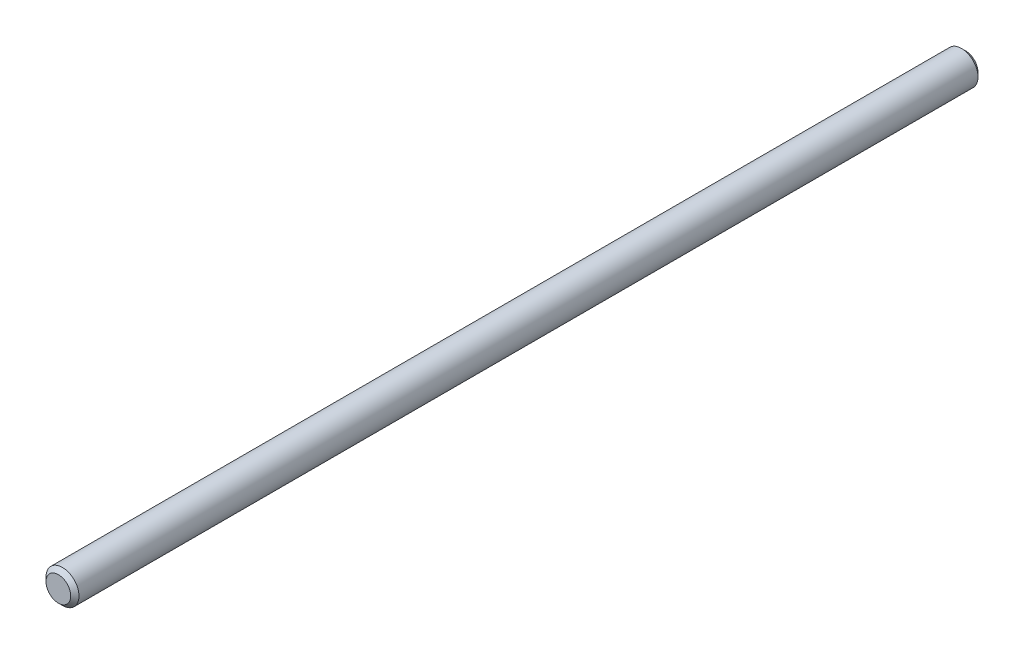
ISO-10303-21;
HEADER;
FILE_DESCRIPTION(('STEP AP214'),'2;1');
FILE_NAME('part.step','',(''),(''),'','','');
FILE_SCHEMA(('AUTOMOTIVE_DESIGN { 1 0 10303 214 1 1 1 1 }'));
ENDSEC;
DATA;
#1=APPLICATION_CONTEXT('core data for automotive mechanical design processes');
#2=APPLICATION_PROTOCOL_DEFINITION('international standard','automotive_design',2000,#1);
#3=PRODUCT_CONTEXT('',#1,'mechanical');
#4=PRODUCT('Part','Part','',(#3));
#5=PRODUCT_RELATED_PRODUCT_CATEGORY('part','',(#4));
#6=PRODUCT_DEFINITION_FORMATION('','',#4);
#7=PRODUCT_DEFINITION_CONTEXT('part definition',#1,'design');
#8=PRODUCT_DEFINITION('design','',#6,#7);
#9=PRODUCT_DEFINITION_SHAPE('','',#8);
#10=(LENGTH_UNIT() NAMED_UNIT(*) SI_UNIT(.MILLI.,.METRE.));
#11=(NAMED_UNIT(*) PLANE_ANGLE_UNIT() SI_UNIT($,.RADIAN.));
#12=(NAMED_UNIT(*) SI_UNIT($,.STERADIAN.) SOLID_ANGLE_UNIT());
#13=UNCERTAINTY_MEASURE_WITH_UNIT(LENGTH_MEASURE(1.E-05),#10,'distance_accuracy_value','');
#14=(GEOMETRIC_REPRESENTATION_CONTEXT(3) GLOBAL_UNCERTAINTY_ASSIGNED_CONTEXT((#13)) GLOBAL_UNIT_ASSIGNED_CONTEXT((#10,
#11,#12)) REPRESENTATION_CONTEXT('',''));
#15=CARTESIAN_POINT('',(0.,0.,0.));
#16=DIRECTION('',(0.,0.,1.));
#17=DIRECTION('',(1.,0.,0.));
#18=AXIS2_PLACEMENT_3D('',#15,#16,#17);
#19=CARTESIAN_POINT('',(0.,0.,-110.));
#20=DIRECTION('',(0.,0.,1.));
#21=DIRECTION('',(1.,0.,0.));
#22=AXIS2_PLACEMENT_3D('',#19,#20,#21);
#23=CYLINDRICAL_SURFACE('',#22,2.);
#24=CARTESIAN_POINT('',(0.,0.,-109.5));
#25=DIRECTION('',(0.,0.,1.));
#26=DIRECTION('',(1.,0.,0.));
#27=AXIS2_PLACEMENT_3D('',#24,#25,#26);
#28=CIRCLE('',#27,2.);
#29=CARTESIAN_POINT('',(2.,0.,-109.5));
#30=VERTEX_POINT('',#29);
#31=EDGE_CURVE('E43',#30,#30,#28,.T.);
#32=ORIENTED_EDGE('',*,*,#31,.T.);
#33=EDGE_LOOP('',(#32));
#34=FACE_BOUND('',#33,.T.);
#35=CARTESIAN_POINT('',(0.,0.,-0.5));
#36=DIRECTION('',(0.,0.,1.));
#37=DIRECTION('',(1.,0.,0.));
#38=AXIS2_PLACEMENT_3D('',#35,#36,#37);
#39=CIRCLE('',#38,2.);
#40=CARTESIAN_POINT('',(2.,0.,-0.5));
#41=VERTEX_POINT('',#40);
#42=EDGE_CURVE('E47',#41,#41,#39,.F.);
#43=ORIENTED_EDGE('',*,*,#42,.T.);
#44=EDGE_LOOP('',(#43));
#45=FACE_BOUND('',#44,.T.);
#46=ADVANCED_FACE('F32',(#34,#45),#23,.T.);
#47=CARTESIAN_POINT('',(0.,0.,-110.));
#48=DIRECTION('',(0.,0.,1.));
#49=DIRECTION('',(1.,0.,0.));
#50=AXIS2_PLACEMENT_3D('',#47,#48,#49);
#51=PLANE('',#50);
#52=CARTESIAN_POINT('',(0.,0.,-110.));
#53=DIRECTION('',(0.,0.,1.));
#54=DIRECTION('',(1.,0.,0.));
#55=AXIS2_PLACEMENT_3D('',#52,#53,#54);
#56=CIRCLE('',#55,1.5);
#57=CARTESIAN_POINT('',(1.5,0.,-110.));
#58=VERTEX_POINT('',#57);
#59=EDGE_CURVE('E39',#58,#58,#56,.F.);
#60=ORIENTED_EDGE('',*,*,#59,.T.);
#61=EDGE_LOOP('',(#60));
#62=FACE_BOUND('',#61,.T.);
#63=ADVANCED_FACE('F63',(#62),#51,.F.);
#64=CARTESIAN_POINT('',(0.,0.,0.));
#65=DIRECTION('',(0.,0.,1.));
#66=DIRECTION('',(1.,0.,0.));
#67=AXIS2_PLACEMENT_3D('',#64,#65,#66);
#68=PLANE('',#67);
#69=CARTESIAN_POINT('',(0.,0.,0.));
#70=DIRECTION('',(0.,0.,1.));
#71=DIRECTION('',(1.,0.,0.));
#72=AXIS2_PLACEMENT_3D('',#69,#70,#71);
#73=CIRCLE('',#72,1.49999999999999);
#74=CARTESIAN_POINT('',(1.49999999999999,0.,0.));
#75=VERTEX_POINT('',#74);
#76=EDGE_CURVE('E10',#75,#75,#73,.T.);
#77=ORIENTED_EDGE('',*,*,#76,.T.);
#78=EDGE_LOOP('',(#77));
#79=FACE_BOUND('',#78,.T.);
#80=ADVANCED_FACE('F60',(#79),#68,.T.);
#81=CARTESIAN_POINT('',(0.,0.,-109.5));
#82=DIRECTION('',(0.,0.,1.));
#83=DIRECTION('',(1.,0.,0.));
#84=AXIS2_PLACEMENT_3D('',#81,#82,#83);
#85=CONICAL_SURFACE('',#84,2.,0.785398163397447);
#86=ORIENTED_EDGE('',*,*,#59,.F.);
#87=EDGE_LOOP('',(#86));
#88=FACE_BOUND('',#87,.T.);
#89=ORIENTED_EDGE('',*,*,#31,.F.);
#90=EDGE_LOOP('',(#89));
#91=FACE_BOUND('',#90,.T.);
#92=ADVANCED_FACE('F56',(#88,#91),#85,.T.);
#93=CARTESIAN_POINT('',(0.,0.,0.));
#94=DIRECTION('',(0.,0.,-1.));
#95=DIRECTION('',(-1.,0.,0.));
#96=AXIS2_PLACEMENT_3D('',#93,#94,#95);
#97=CONICAL_SURFACE('',#96,1.49999999999999,0.78539816339746);
#98=ORIENTED_EDGE('',*,*,#42,.F.);
#99=EDGE_LOOP('',(#98));
#100=FACE_BOUND('',#99,.T.);
#101=ORIENTED_EDGE('',*,*,#76,.F.);
#102=EDGE_LOOP('',(#101));
#103=FACE_BOUND('',#102,.T.);
#104=ADVANCED_FACE('F34',(#100,#103),#97,.T.);
#105=CLOSED_SHELL('',(#46,#63,#80,#92,#104));
#106=MANIFOLD_SOLID_BREP('B2',#105);
#107=ADVANCED_BREP_SHAPE_REPRESENTATION('',(#18,#106),#14);
#108=SHAPE_DEFINITION_REPRESENTATION(#9,#107);
ENDSEC;
END-ISO-10303-21;
